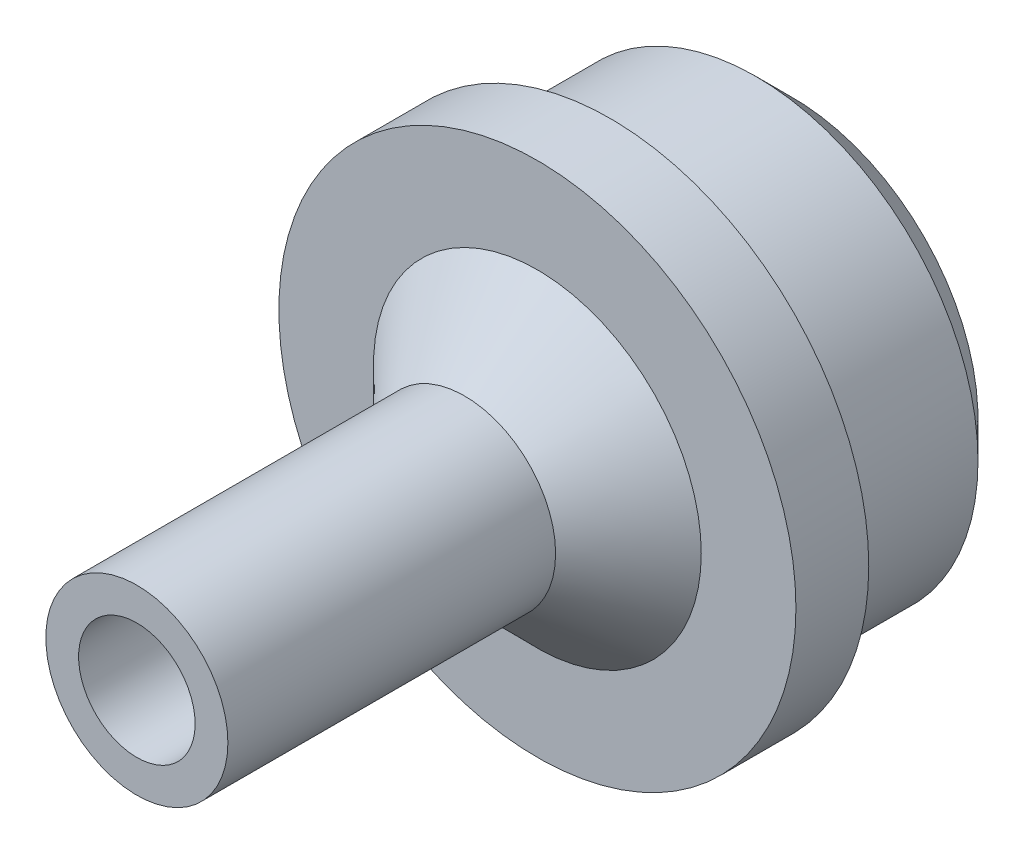
ISO-10303-21;
HEADER;
FILE_DESCRIPTION(('STEP AP214'),'2;1');
FILE_NAME('part.step','',(''),(''),'','','');
FILE_SCHEMA(('AUTOMOTIVE_DESIGN { 1 0 10303 214 1 1 1 1 }'));
ENDSEC;
DATA;
#1=APPLICATION_CONTEXT('core data for automotive mechanical design processes');
#2=APPLICATION_PROTOCOL_DEFINITION('international standard','automotive_design',2000,#1);
#3=PRODUCT_CONTEXT('',#1,'mechanical');
#4=PRODUCT('Part','Part','',(#3));
#5=PRODUCT_RELATED_PRODUCT_CATEGORY('part','',(#4));
#6=PRODUCT_DEFINITION_FORMATION('','',#4);
#7=PRODUCT_DEFINITION_CONTEXT('part definition',#1,'design');
#8=PRODUCT_DEFINITION('design','',#6,#7);
#9=PRODUCT_DEFINITION_SHAPE('','',#8);
#10=(LENGTH_UNIT() NAMED_UNIT(*) SI_UNIT(.MILLI.,.METRE.));
#11=(NAMED_UNIT(*) PLANE_ANGLE_UNIT() SI_UNIT($,.RADIAN.));
#12=(NAMED_UNIT(*) SI_UNIT($,.STERADIAN.) SOLID_ANGLE_UNIT());
#13=UNCERTAINTY_MEASURE_WITH_UNIT(LENGTH_MEASURE(1.E-05),#10,'distance_accuracy_value','');
#14=(GEOMETRIC_REPRESENTATION_CONTEXT(3) GLOBAL_UNCERTAINTY_ASSIGNED_CONTEXT((#13)) GLOBAL_UNIT_ASSIGNED_CONTEXT((#10,
#11,#12)) REPRESENTATION_CONTEXT('',''));
#15=CARTESIAN_POINT('',(0.,0.,0.));
#16=DIRECTION('',(0.,0.,1.));
#17=DIRECTION('',(1.,0.,0.));
#18=AXIS2_PLACEMENT_3D('',#15,#16,#17);
#19=CARTESIAN_POINT('',(0.,-0.874999999999985,-5.));
#20=DIRECTION('',(0.,-1.,0.));
#21=DIRECTION('',(1.,0.,0.));
#22=AXIS2_PLACEMENT_3D('',#19,#20,#21);
#23=PLANE('',#22);
#24=DIRECTION('',(1.,0.,0.));
#25=VECTOR('',#24,1.);
#26=CARTESIAN_POINT('',(0.,-0.874999999999985,0.));
#27=LINE('',#26,#25);
#28=CARTESIAN_POINT('',(-6.35,-0.875,0.));
#29=VERTEX_POINT('',#28);
#30=CARTESIAN_POINT('',(-6.03691767378022,-0.874999999999999,0.));
#31=VERTEX_POINT('',#30);
#32=EDGE_CURVE('E85',#29,#31,#27,.T.);
#33=ORIENTED_EDGE('',*,*,#32,.F.);
#34=DIRECTION('',(0.,0.,1.));
#35=VECTOR('',#34,1.);
#36=CARTESIAN_POINT('',(-6.35,-0.875,-5.));
#37=LINE('',#36,#35);
#38=CARTESIAN_POINT('',(-6.35,-0.875,-5.));
#39=VERTEX_POINT('',#38);
#40=EDGE_CURVE('E87',#39,#29,#37,.T.);
#41=ORIENTED_EDGE('',*,*,#40,.F.);
#42=DIRECTION('',(1.,0.,0.));
#43=VECTOR('',#42,1.);
#44=CARTESIAN_POINT('',(0.,-0.874999999999985,-5.));
#45=LINE('',#44,#43);
#46=CARTESIAN_POINT('',(-5.0243780709656,-0.874999999999997,-5.));
#47=VERTEX_POINT('',#46);
#48=EDGE_CURVE('E62',#39,#47,#45,.T.);
#49=ORIENTED_EDGE('',*,*,#48,.T.);
#50=CARTESIAN_POINT('',(-5.0243780709656,-0.874999999999997,-5.));
#51=CARTESIAN_POINT('',(-5.19332243294403,-0.874999999999997,-4.83352343973465));
#52=CARTESIAN_POINT('',(-5.36217291655565,-0.874999999999998,-4.66695182390504));
#53=CARTESIAN_POINT('',(-5.69968611748322,-0.874999999999998,-4.33361849056093));
#54=CARTESIAN_POINT('',(-5.86834883480981,-0.874999999999999,-4.16685677305721));
#55=CARTESIAN_POINT('',(-6.03691767378022,-0.874999999999999,-4.));
#56=B_SPLINE_CURVE_WITH_KNOTS('',3,(#50,#51,#52,#53,#54,#55),.UNSPECIFIED.,.F.,.F.,(4,2,4),(0.,
0.711554144913555,1.4231082495093),.UNSPECIFIED.);
#57=CARTESIAN_POINT('',(-6.03691767378022,-0.874999999999999,-4.));
#58=VERTEX_POINT('',#57);
#59=EDGE_CURVE('E12',#47,#58,#56,.T.);
#60=ORIENTED_EDGE('',*,*,#59,.T.);
#61=DIRECTION('',(0.,0.,1.));
#62=VECTOR('',#61,1.);
#63=CARTESIAN_POINT('',(-6.03691767378022,-0.874999999999999,-5.));
#64=LINE('',#63,#62);
#65=EDGE_CURVE('E89',#58,#31,#64,.T.);
#66=ORIENTED_EDGE('',*,*,#65,.T.);
#67=EDGE_LOOP('',(#33,#41,#49,#60,#66));
#68=FACE_BOUND('',#67,.T.);
#69=ADVANCED_FACE('F38',(#68),#23,.T.);
#70=CARTESIAN_POINT('',(-6.35,0.,-5.));
#71=DIRECTION('',(-1.,0.,0.));
#72=DIRECTION('',(0.,0.,1.));
#73=AXIS2_PLACEMENT_3D('',#70,#71,#72);
#74=PLANE('',#73);
#75=DIRECTION('',(0.,-1.,0.));
#76=VECTOR('',#75,1.);
#77=CARTESIAN_POINT('',(-6.35,0.,0.));
#78=LINE('',#77,#76);
#79=CARTESIAN_POINT('',(-6.35,0.875,0.));
#80=VERTEX_POINT('',#79);
#81=EDGE_CURVE('E101',#80,#29,#78,.T.);
#82=ORIENTED_EDGE('',*,*,#81,.F.);
#83=DIRECTION('',(0.,0.,1.));
#84=VECTOR('',#83,1.);
#85=CARTESIAN_POINT('',(-6.35,0.875,-5.));
#86=LINE('',#85,#84);
#87=CARTESIAN_POINT('',(-6.35,0.875,-5.));
#88=VERTEX_POINT('',#87);
#89=EDGE_CURVE('E105',#88,#80,#86,.T.);
#90=ORIENTED_EDGE('',*,*,#89,.F.);
#91=DIRECTION('',(0.,-1.,0.));
#92=VECTOR('',#91,1.);
#93=CARTESIAN_POINT('',(-6.35,0.,-5.));
#94=LINE('',#93,#92);
#95=EDGE_CURVE('E103',#88,#39,#94,.T.);
#96=ORIENTED_EDGE('',*,*,#95,.T.);
#97=ORIENTED_EDGE('',*,*,#40,.T.);
#98=EDGE_LOOP('',(#82,#90,#96,#97));
#99=FACE_BOUND('',#98,.T.);
#100=ADVANCED_FACE('F100',(#99),#74,.T.);
#101=CARTESIAN_POINT('',(0.,0.875,-5.));
#102=DIRECTION('',(0.,1.,0.));
#103=DIRECTION('',(0.,0.,1.));
#104=AXIS2_PLACEMENT_3D('',#101,#102,#103);
#105=PLANE('',#104);
#106=DIRECTION('',(-1.,0.,0.));
#107=VECTOR('',#106,1.);
#108=CARTESIAN_POINT('',(0.,0.875,0.));
#109=LINE('',#108,#107);
#110=CARTESIAN_POINT('',(-6.03691767378022,0.875,0.));
#111=VERTEX_POINT('',#110);
#112=EDGE_CURVE('E109',#111,#80,#109,.T.);
#113=ORIENTED_EDGE('',*,*,#112,.F.);
#114=DIRECTION('',(0.,0.,1.));
#115=VECTOR('',#114,1.);
#116=CARTESIAN_POINT('',(-6.03691767378022,0.875,-5.));
#117=LINE('',#116,#115);
#118=CARTESIAN_POINT('',(-6.03691767378022,0.875,-4.));
#119=VERTEX_POINT('',#118);
#120=EDGE_CURVE('E116',#119,#111,#117,.T.);
#121=ORIENTED_EDGE('',*,*,#120,.F.);
#122=CARTESIAN_POINT('',(-6.03691767378022,0.875,-4.));
#123=CARTESIAN_POINT('',(-5.86834883480981,0.875,-4.16685677305721));
#124=CARTESIAN_POINT('',(-5.69968611748322,0.875,-4.33361849056093));
#125=CARTESIAN_POINT('',(-5.36217291655565,0.875,-4.66695182390504));
#126=CARTESIAN_POINT('',(-5.19332243294403,0.875,-4.83352343973465));
#127=CARTESIAN_POINT('',(-5.02437807096559,0.875,-5.));
#128=B_SPLINE_CURVE_WITH_KNOTS('',3,(#122,#123,#124,#125,#126,#127),.UNSPECIFIED.,.F.,.F.,(4,2,
4),(0.,0.711554104595742,1.4231082495093),.UNSPECIFIED.);
#129=CARTESIAN_POINT('',(-5.02437807096559,0.875,-5.));
#130=VERTEX_POINT('',#129);
#131=EDGE_CURVE('E47',#119,#130,#128,.T.);
#132=ORIENTED_EDGE('',*,*,#131,.T.);
#133=DIRECTION('',(-1.,0.,0.));
#134=VECTOR('',#133,1.);
#135=CARTESIAN_POINT('',(0.,0.875,-5.));
#136=LINE('',#135,#134);
#137=EDGE_CURVE('E55',#130,#88,#136,.T.);
#138=ORIENTED_EDGE('',*,*,#137,.T.);
#139=ORIENTED_EDGE('',*,*,#89,.T.);
#140=EDGE_LOOP('',(#113,#121,#132,#138,#139));
#141=FACE_BOUND('',#140,.T.);
#142=ADVANCED_FACE('F143',(#141),#105,.T.);
#143=CARTESIAN_POINT('',(0.,0.,-5.));
#144=DIRECTION('',(0.,0.,1.));
#145=DIRECTION('',(1.,0.,0.));
#146=AXIS2_PLACEMENT_3D('',#143,#144,#145);
#147=CYLINDRICAL_SURFACE('',#146,6.1);
#148=ORIENTED_EDGE('',*,*,#65,.F.);
#149=CARTESIAN_POINT('',(0.,0.,-4.));
#150=DIRECTION('',(0.,0.,1.));
#151=DIRECTION('',(1.,0.,0.));
#152=AXIS2_PLACEMENT_3D('',#149,#150,#151);
#153=CIRCLE('',#152,6.1);
#154=EDGE_CURVE('E124',#58,#119,#153,.T.);
#155=ORIENTED_EDGE('',*,*,#154,.T.);
#156=ORIENTED_EDGE('',*,*,#120,.T.);
#157=CARTESIAN_POINT('',(0.,0.,0.));
#158=DIRECTION('',(0.,0.,1.));
#159=DIRECTION('',(1.,0.,0.));
#160=AXIS2_PLACEMENT_3D('',#157,#158,#159);
#161=CIRCLE('',#160,6.1);
#162=EDGE_CURVE('E94',#31,#111,#161,.T.);
#163=ORIENTED_EDGE('',*,*,#162,.F.);
#164=EDGE_LOOP('',(#148,#155,#156,#163));
#165=FACE_BOUND('',#164,.T.);
#166=ADVANCED_FACE('F148',(#165),#147,.T.);
#167=CARTESIAN_POINT('',(0.,0.,-5.));
#168=DIRECTION('',(0.,0.,1.));
#169=DIRECTION('',(1.,0.,0.));
#170=AXIS2_PLACEMENT_3D('',#167,#168,#169);
#171=PLANE('',#170);
#172=CARTESIAN_POINT('',(0.,0.,-5.));
#173=DIRECTION('',(0.,0.,1.));
#174=DIRECTION('',(1.,0.,0.));
#175=AXIS2_PLACEMENT_3D('',#172,#173,#174);
#176=CIRCLE('',#175,1.6);
#177=CARTESIAN_POINT('',(1.6,0.,-5.));
#178=VERTEX_POINT('',#177);
#179=EDGE_CURVE('E183',#178,#178,#176,.T.);
#180=ORIENTED_EDGE('',*,*,#179,.T.);
#181=EDGE_LOOP('',(#180));
#182=FACE_BOUND('',#181,.T.);
#183=ORIENTED_EDGE('',*,*,#137,.F.);
#184=CARTESIAN_POINT('',(0.,0.,-5.));
#185=DIRECTION('',(0.,0.,1.));
#186=DIRECTION('',(1.,0.,0.));
#187=AXIS2_PLACEMENT_3D('',#184,#185,#186);
#188=CIRCLE('',#187,5.1);
#189=EDGE_CURVE('E127',#130,#47,#188,.F.);
#190=ORIENTED_EDGE('',*,*,#189,.T.);
#191=ORIENTED_EDGE('',*,*,#48,.F.);
#192=ORIENTED_EDGE('',*,*,#95,.F.);
#193=EDGE_LOOP('',(#183,#190,#191,#192));
#194=FACE_BOUND('',#193,.T.);
#195=ADVANCED_FACE('F152',(#182,#194),#171,.F.);
#196=CARTESIAN_POINT('',(0.,0.,0.));
#197=DIRECTION('',(0.,0.,1.));
#198=DIRECTION('',(1.,0.,0.));
#199=AXIS2_PLACEMENT_3D('',#196,#197,#198);
#200=PLANE('',#199);
#201=CARTESIAN_POINT('',(0.,0.,0.));
#202=DIRECTION('',(0.,0.,1.));
#203=DIRECTION('',(1.,0.,0.));
#204=AXIS2_PLACEMENT_3D('',#201,#202,#203);
#205=CIRCLE('',#204,7.1);
#206=CARTESIAN_POINT('',(7.1,0.,0.));
#207=VERTEX_POINT('',#206);
#208=EDGE_CURVE('E182',#207,#207,#205,.T.);
#209=ORIENTED_EDGE('',*,*,#208,.F.);
#210=EDGE_LOOP('',(#209));
#211=FACE_BOUND('',#210,.T.);
#212=ORIENTED_EDGE('',*,*,#81,.T.);
#213=ORIENTED_EDGE('',*,*,#32,.T.);
#214=ORIENTED_EDGE('',*,*,#162,.T.);
#215=ORIENTED_EDGE('',*,*,#112,.T.);
#216=EDGE_LOOP('',(#212,#213,#214,#215));
#217=FACE_BOUND('',#216,.T.);
#218=ADVANCED_FACE('F107',(#211,#217),#200,.F.);
#219=CARTESIAN_POINT('',(0.,0.,2.));
#220=DIRECTION('',(0.,0.,-1.));
#221=DIRECTION('',(-1.,0.,0.));
#222=AXIS2_PLACEMENT_3D('',#219,#220,#221);
#223=CYLINDRICAL_SURFACE('',#222,7.1);
#224=CARTESIAN_POINT('',(0.,0.,2.));
#225=DIRECTION('',(0.,0.,1.));
#226=DIRECTION('',(1.,0.,0.));
#227=AXIS2_PLACEMENT_3D('',#224,#225,#226);
#228=CIRCLE('',#227,7.1);
#229=CARTESIAN_POINT('',(7.1,0.,2.));
#230=VERTEX_POINT('',#229);
#231=EDGE_CURVE('E95',#230,#230,#228,.T.);
#232=ORIENTED_EDGE('',*,*,#231,.F.);
#233=EDGE_LOOP('',(#232));
#234=FACE_BOUND('',#233,.T.);
#235=ORIENTED_EDGE('',*,*,#208,.T.);
#236=EDGE_LOOP('',(#235));
#237=FACE_BOUND('',#236,.T.);
#238=ADVANCED_FACE('F231',(#234,#237),#223,.T.);
#239=CARTESIAN_POINT('',(0.,0.,2.));
#240=DIRECTION('',(0.,0.,1.));
#241=DIRECTION('',(1.,0.,0.));
#242=AXIS2_PLACEMENT_3D('',#239,#240,#241);
#243=PLANE('',#242);
#244=CARTESIAN_POINT('',(0.,0.,2.));
#245=DIRECTION('',(0.,0.,1.));
#246=DIRECTION('',(1.,0.,0.));
#247=AXIS2_PLACEMENT_3D('',#244,#245,#246);
#248=CIRCLE('',#247,4.5);
#249=CARTESIAN_POINT('',(4.5,0.,2.));
#250=VERTEX_POINT('',#249);
#251=EDGE_CURVE('E121',#250,#250,#248,.F.);
#252=ORIENTED_EDGE('',*,*,#251,.T.);
#253=EDGE_LOOP('',(#252));
#254=FACE_BOUND('',#253,.T.);
#255=ORIENTED_EDGE('',*,*,#231,.T.);
#256=EDGE_LOOP('',(#255));
#257=FACE_BOUND('',#256,.T.);
#258=ADVANCED_FACE('F177',(#254,#257),#243,.T.);
#259=CARTESIAN_POINT('',(0.,0.,9.));
#260=DIRECTION('',(0.,0.,-1.));
#261=DIRECTION('',(-1.,0.,0.));
#262=AXIS2_PLACEMENT_3D('',#259,#260,#261);
#263=CYLINDRICAL_SURFACE('',#262,2.5);
#264=CARTESIAN_POINT('',(0.,0.,4.00000000000002));
#265=DIRECTION('',(0.,0.,1.));
#266=DIRECTION('',(1.,0.,0.));
#267=AXIS2_PLACEMENT_3D('',#264,#265,#266);
#268=CIRCLE('',#267,2.5);
#269=CARTESIAN_POINT('',(2.5,0.,4.00000000000002));
#270=VERTEX_POINT('',#269);
#271=EDGE_CURVE('E104',#270,#270,#268,.T.);
#272=ORIENTED_EDGE('',*,*,#271,.T.);
#273=EDGE_LOOP('',(#272));
#274=FACE_BOUND('',#273,.T.);
#275=CARTESIAN_POINT('',(0.,0.,13.));
#276=DIRECTION('',(0.,0.,1.));
#277=DIRECTION('',(1.,0.,0.));
#278=AXIS2_PLACEMENT_3D('',#275,#276,#277);
#279=CIRCLE('',#278,2.5);
#280=CARTESIAN_POINT('',(2.5,0.,13.));
#281=VERTEX_POINT('',#280);
#282=EDGE_CURVE('E42',#281,#281,#279,.T.);
#283=ORIENTED_EDGE('',*,*,#282,.F.);
#284=EDGE_LOOP('',(#283));
#285=FACE_BOUND('',#284,.T.);
#286=ADVANCED_FACE('F169',(#274,#285),#263,.T.);
#287=CARTESIAN_POINT('',(0.,0.,13.));
#288=DIRECTION('',(0.,0.,1.));
#289=DIRECTION('',(1.,0.,0.));
#290=AXIS2_PLACEMENT_3D('',#287,#288,#289);
#291=PLANE('',#290);
#292=CARTESIAN_POINT('',(0.,0.,13.));
#293=DIRECTION('',(0.,0.,1.));
#294=DIRECTION('',(1.,0.,0.));
#295=AXIS2_PLACEMENT_3D('',#292,#293,#294);
#296=CIRCLE('',#295,1.6);
#297=CARTESIAN_POINT('',(1.6,0.,13.));
#298=VERTEX_POINT('',#297);
#299=EDGE_CURVE('E187',#298,#298,#296,.T.);
#300=ORIENTED_EDGE('',*,*,#299,.F.);
#301=EDGE_LOOP('',(#300));
#302=FACE_BOUND('',#301,.T.);
#303=ORIENTED_EDGE('',*,*,#282,.T.);
#304=EDGE_LOOP('',(#303));
#305=FACE_BOUND('',#304,.T.);
#306=ADVANCED_FACE('F40',(#302,#305),#291,.T.);
#307=CARTESIAN_POINT('',(0.,0.,4.00000000000002));
#308=DIRECTION('',(0.,0.,-1.));
#309=DIRECTION('',(-1.,0.,0.));
#310=AXIS2_PLACEMENT_3D('',#307,#308,#309);
#311=CONICAL_SURFACE('',#310,2.5,0.785398163397444);
#312=ORIENTED_EDGE('',*,*,#251,.F.);
#313=EDGE_LOOP('',(#312));
#314=FACE_BOUND('',#313,.T.);
#315=ORIENTED_EDGE('',*,*,#271,.F.);
#316=EDGE_LOOP('',(#315));
#317=FACE_BOUND('',#316,.T.);
#318=ADVANCED_FACE('F157',(#314,#317),#311,.T.);
#319=CARTESIAN_POINT('',(0.,0.,-21.));
#320=DIRECTION('',(0.,0.,1.));
#321=DIRECTION('',(1.,0.,0.));
#322=AXIS2_PLACEMENT_3D('',#319,#320,#321);
#323=CYLINDRICAL_SURFACE('',#322,1.6);
#324=ORIENTED_EDGE('',*,*,#299,.T.);
#325=EDGE_LOOP('',(#324));
#326=FACE_BOUND('',#325,.T.);
#327=ORIENTED_EDGE('',*,*,#179,.F.);
#328=EDGE_LOOP('',(#327));
#329=FACE_BOUND('',#328,.T.);
#330=ADVANCED_FACE('F161',(#326,#329),#323,.F.);
#331=CARTESIAN_POINT('',(0.,0.,-4.));
#332=DIRECTION('',(0.,0.,1.));
#333=DIRECTION('',(1.,0.,0.));
#334=AXIS2_PLACEMENT_3D('',#331,#332,#333);
#335=CONICAL_SURFACE('',#334,6.1,0.78539816339745);
#336=ORIENTED_EDGE('',*,*,#59,.F.);
#337=ORIENTED_EDGE('',*,*,#189,.F.);
#338=ORIENTED_EDGE('',*,*,#131,.F.);
#339=ORIENTED_EDGE('',*,*,#154,.F.);
#340=EDGE_LOOP('',(#336,#337,#338,#339));
#341=FACE_BOUND('',#340,.T.);
#342=ADVANCED_FACE('F140',(#341),#335,.T.);
#343=CLOSED_SHELL('',(#69,#100,#142,#166,#195,#218,#238,#258,#286,#306,#318,#330,#342));
#344=MANIFOLD_SOLID_BREP('B2',#343);
#345=ADVANCED_BREP_SHAPE_REPRESENTATION('',(#18,#344),#14);
#346=SHAPE_DEFINITION_REPRESENTATION(#9,#345);
ENDSEC;
END-ISO-10303-21;
